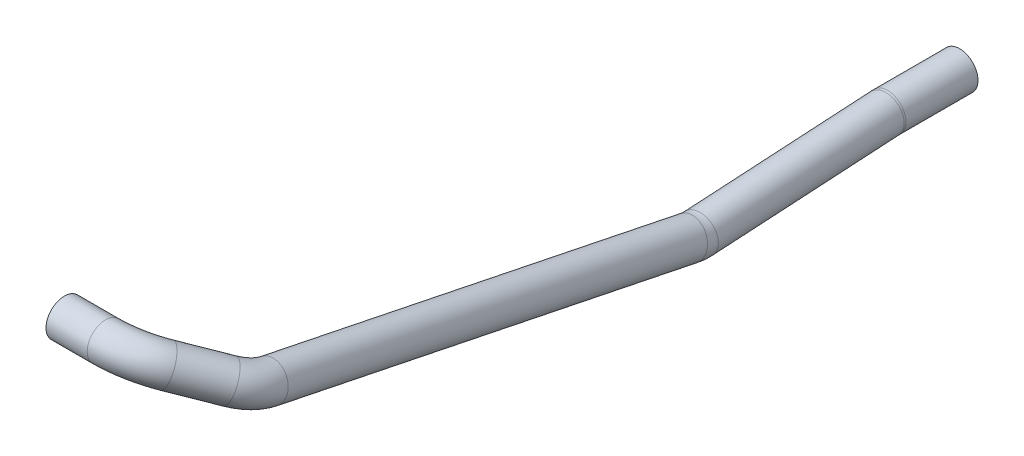
ISO-10303-21;
HEADER;
FILE_DESCRIPTION(('STEP AP214'),'2;1');
FILE_NAME('part.step','',(''),(''),'','','');
FILE_SCHEMA(('AUTOMOTIVE_DESIGN { 1 0 10303 214 1 1 1 1 }'));
ENDSEC;
DATA;
#1=APPLICATION_CONTEXT('core data for automotive mechanical design processes');
#2=APPLICATION_PROTOCOL_DEFINITION('international standard','automotive_design',2000,#1);
#3=PRODUCT_CONTEXT('',#1,'mechanical');
#4=PRODUCT('Part','Part','',(#3));
#5=PRODUCT_RELATED_PRODUCT_CATEGORY('part','',(#4));
#6=PRODUCT_DEFINITION_FORMATION('','',#4);
#7=PRODUCT_DEFINITION_CONTEXT('part definition',#1,'design');
#8=PRODUCT_DEFINITION('design','',#6,#7);
#9=PRODUCT_DEFINITION_SHAPE('','',#8);
#10=(LENGTH_UNIT() NAMED_UNIT(*) SI_UNIT(.MILLI.,.METRE.));
#11=(NAMED_UNIT(*) PLANE_ANGLE_UNIT() SI_UNIT($,.RADIAN.));
#12=(NAMED_UNIT(*) SI_UNIT($,.STERADIAN.) SOLID_ANGLE_UNIT());
#13=UNCERTAINTY_MEASURE_WITH_UNIT(LENGTH_MEASURE(1.E-05),#10,'distance_accuracy_value','');
#14=(GEOMETRIC_REPRESENTATION_CONTEXT(3) GLOBAL_UNCERTAINTY_ASSIGNED_CONTEXT((#13)) GLOBAL_UNIT_ASSIGNED_CONTEXT((#10,
#11,#12)) REPRESENTATION_CONTEXT('',''));
#15=CARTESIAN_POINT('',(0.,0.,0.));
#16=DIRECTION('',(0.,0.,1.));
#17=DIRECTION('',(1.,0.,0.));
#18=AXIS2_PLACEMENT_3D('',#15,#16,#17);
#19=CARTESIAN_POINT('',(84.,-22.,-33.));
#20=DIRECTION('',(0.,0.,-1.));
#21=DIRECTION('',(0.,-1.,0.));
#22=AXIS2_PLACEMENT_3D('',#19,#20,#21);
#23=PLANE('',#22);
#24=CARTESIAN_POINT('',(84.,-22.,-33.));
#25=DIRECTION('',(0.,0.,-1.));
#26=DIRECTION('',(0.926024073337656,-0.37746445607386,0.));
#27=AXIS2_PLACEMENT_3D('',#24,#25,#26);
#28=CIRCLE('',#27,3.25);
#29=CARTESIAN_POINT('',(87.0095782383474,-23.22675948224,-33.));
#30=VERTEX_POINT('',#29);
#31=EDGE_CURVE('E10',#30,#30,#28,.T.);
#32=ORIENTED_EDGE('',*,*,#31,.T.);
#33=EDGE_LOOP('',(#32));
#34=FACE_BOUND('',#33,.T.);
#35=ADVANCED_FACE('F15',(#34),#23,.T.);
#36=CARTESIAN_POINT('',(64.7,0.,106.1));
#37=DIRECTION('',(1.,0.,0.));
#38=DIRECTION('',(0.,1.,0.));
#39=AXIS2_PLACEMENT_3D('',#36,#37,#38);
#40=PLANE('',#39);
#41=CARTESIAN_POINT('',(64.7,0.,106.1));
#42=DIRECTION('',(1.,0.,0.));
#43=DIRECTION('',(0.,0.,1.));
#44=AXIS2_PLACEMENT_3D('',#41,#42,#43);
#45=CIRCLE('',#44,3.25);
#46=CARTESIAN_POINT('',(64.7,0.,109.35));
#47=VERTEX_POINT('',#46);
#48=EDGE_CURVE('E36',#47,#47,#45,.T.);
#49=ORIENTED_EDGE('',*,*,#48,.F.);
#50=EDGE_LOOP('',(#49));
#51=FACE_BOUND('',#50,.T.);
#52=ADVANCED_FACE('F17',(#51),#40,.F.);
#53=CARTESIAN_POINT('',(84.,-22.,-20.24980739588));
#54=DIRECTION('',(0.,0.,-1.));
#55=DIRECTION('',(0.926024073337656,-0.37746445607386,0.));
#56=AXIS2_PLACEMENT_3D('',#53,#54,#55);
#57=CYLINDRICAL_SURFACE('',#56,3.25);
#58=ORIENTED_EDGE('',*,*,#31,.F.);
#59=EDGE_LOOP('',(#58));
#60=FACE_BOUND('',#59,.T.);
#61=CARTESIAN_POINT('',(84.,-22.,-20.24980739588));
#62=DIRECTION('',(0.,0.,1.));
#63=DIRECTION('',(-1.,0.,0.));
#64=AXIS2_PLACEMENT_3D('',#61,#62,#63);
#65=CIRCLE('',#64,3.25);
#66=CARTESIAN_POINT('',(80.75,-22.,-20.24980739588));
#67=VERTEX_POINT('',#66);
#68=EDGE_CURVE('E19',#67,#67,#65,.T.);
#69=ORIENTED_EDGE('',*,*,#68,.F.);
#70=EDGE_LOOP('',(#69));
#71=FACE_BOUND('',#70,.T.);
#72=ADVANCED_FACE('F71',(#60,#71),#57,.T.);
#73=CARTESIAN_POINT('',(93.,-22.,-20.24980739588));
#74=DIRECTION('',(0.,-1.,0.));
#75=DIRECTION('',(-0.998460353205411,0.,0.0554700196225528));
#76=AXIS2_PLACEMENT_3D('',#73,#74,#75);
#77=TOROIDAL_SURFACE('',#76,9.,3.25);
#78=CARTESIAN_POINT('',(84.013856821151,-22.,-19.75057721927));
#79=DIRECTION('',(-0.0554700196225401,0.,-0.998460353205411));
#80=DIRECTION('',(0.92459832334132,-0.37746445607413,-0.0513665735189778));
#81=AXIS2_PLACEMENT_3D('',#78,#79,#80);
#82=CIRCLE('',#81,3.25);
#83=CARTESIAN_POINT('',(80.7688606732342,-22.,-19.5702996554942));
#84=VERTEX_POINT('',#83);
#85=EDGE_CURVE('E33',#84,#84,#82,.T.);
#86=CARTESIAN_POINT('',(93.,-22.,-20.24980739588));
#87=DIRECTION('',(0.,-1.,0.));
#88=DIRECTION('',(-0.998460353205411,0.,0.0554700196225528));
#89=AXIS2_PLACEMENT_3D('',#86,#87,#88);
#90=CIRCLE('',#89,12.25);
#91=EDGE_CURVE('',#84,#67,#90,.T.);
#92=ORIENTED_EDGE('',*,*,#85,.T.);
#93=ORIENTED_EDGE('',*,*,#68,.T.);
#94=ORIENTED_EDGE('',*,*,#91,.T.);
#95=ORIENTED_EDGE('',*,*,#91,.F.);
#96=EDGE_LOOP('',(#92,#94,#93,#95));
#97=FACE_BOUND('',#96,.T.);
#98=ADVANCED_FACE('F60',(#97),#77,.T.);
#99=CARTESIAN_POINT('',(85.947525635538,-22.,15.055461439676));
#100=DIRECTION('',(-0.0554700196225401,0.,-0.998460353205411));
#101=DIRECTION('',(0.92459832334132,-0.37746445607413,-0.0513665735189778));
#102=AXIS2_PLACEMENT_3D('',#99,#100,#101);
#103=CYLINDRICAL_SURFACE('',#102,3.25);
#104=ORIENTED_EDGE('',*,*,#85,.F.);
#105=EDGE_LOOP('',(#104));
#106=FACE_BOUND('',#105,.T.);
#107=CARTESIAN_POINT('',(85.947525635538,-22.,15.055461439676));
#108=DIRECTION('',(0.0554700196225338,0.,0.998460353205412));
#109=DIRECTION('',(0.260949865530859,-0.965243491790476,-0.0144972147516821));
#110=AXIS2_PLACEMENT_3D('',#107,#108,#109);
#111=CIRCLE('',#110,3.25);
#112=CARTESIAN_POINT('',(86.7956126985109,-25.1370413483145,15.0083454917332));
#113=VERTEX_POINT('',#112);
#114=EDGE_CURVE('E45',#113,#113,#111,.T.);
#115=ORIENTED_EDGE('',*,*,#114,.F.);
#116=EDGE_LOOP('',(#115));
#117=FACE_BOUND('',#116,.T.);
#118=ADVANCED_FACE('F58',(#106,#117),#103,.T.);
#119=CARTESIAN_POINT('',(83.598976845762,-13.31280857388,15.185936372441));
#120=DIRECTION('',(0.963757357742389,0.261352255693411,-0.0535420754302142));
#121=DIRECTION('',(0.266780350470961,-0.944148093899862,0.193423425126971));
#122=AXIS2_PLACEMENT_3D('',#119,#120,#121);
#123=TOROIDAL_SURFACE('',#122,9.,3.25);
#124=CARTESIAN_POINT('',(86.,-21.81014141898,16.926747198582));
#125=DIRECTION('',(-1.18732111585001E-13,-0.200697222773899,-0.979653318664743));
#126=DIRECTION('',(0.928133717121023,-0.364672974877009,0.0747089321130019));
#127=AXIS2_PLACEMENT_3D('',#124,#125,#126);
#128=CIRCLE('',#127,3.25);
#129=CARTESIAN_POINT('',(86.8670361390301,-24.8786227241541,17.5553733302439));
#130=VERTEX_POINT('',#129);
#131=EDGE_CURVE('E46',#130,#130,#128,.T.);
#132=CARTESIAN_POINT('',(83.598976845762,-13.31280857388,15.185936372441));
#133=DIRECTION('',(0.963757357742389,0.261352255693411,-0.0535420754302142));
#134=DIRECTION('',(0.266780350470961,-0.944148093899862,0.193423425126971));
#135=AXIS2_PLACEMENT_3D('',#132,#133,#134);
#136=CIRCLE('',#135,12.25);
#137=EDGE_CURVE('',#130,#113,#136,.T.);
#138=ORIENTED_EDGE('',*,*,#131,.T.);
#139=ORIENTED_EDGE('',*,*,#114,.T.);
#140=ORIENTED_EDGE('',*,*,#137,.T.);
#141=ORIENTED_EDGE('',*,*,#137,.F.);
#142=EDGE_LOOP('',(#138,#140,#139,#141));
#143=FACE_BOUND('',#142,.T.);
#144=ADVANCED_FACE('F55',(#143),#123,.T.);
#145=CARTESIAN_POINT('',(86.,-6.612244355225,91.111482241056));
#146=DIRECTION('',(-1.18732111585001E-13,-0.200697222773899,-0.979653318664743));
#147=DIRECTION('',(0.928133717121023,-0.364672974877009,0.0747089321130019));
#148=AXIS2_PLACEMENT_3D('',#145,#146,#147);
#149=CYLINDRICAL_SURFACE('',#148,3.25);
#150=ORIENTED_EDGE('',*,*,#131,.F.);
#151=EDGE_LOOP('',(#150));
#152=FACE_BOUND('',#151,.T.);
#153=CARTESIAN_POINT('',(86.,-6.612244355225,91.111482241056));
#154=DIRECTION('',(0.,0.20069722277391,0.979653318664741));
#155=DIRECTION('',(0.936922258101465,-0.342425877883804,0.0701512681963599));
#156=AXIS2_PLACEMENT_3D('',#153,#154,#155);
#157=CIRCLE('',#156,3.25);
#158=CARTESIAN_POINT('',(89.0449973388296,-7.72512845834674,91.3394738626944));
#159=VERTEX_POINT('',#158);
#160=EDGE_CURVE('E49',#159,#159,#157,.T.);
#161=ORIENTED_EDGE('',*,*,#160,.F.);
#162=EDGE_LOOP('',(#161));
#163=FACE_BOUND('',#162,.T.);
#164=ADVANCED_FACE('F69',(#152,#163),#149,.T.);
#165=CARTESIAN_POINT('',(77.567699677086,-3.530411454272,90.480120827288));
#166=DIRECTION('',(0.349537812366846,0.917858999479875,-0.188037695156057));
#167=DIRECTION('',(0.743821753973419,-0.149817756898084,0.651370737778367));
#168=AXIS2_PLACEMENT_3D('',#165,#166,#167);
#169=TOROIDAL_SURFACE('',#168,9.,3.25);
#170=CARTESIAN_POINT('',(84.262095462848,-4.878771266353,96.342457467293));
#171=DIRECTION('',(0.569695107967355,-0.367545230947144,-0.735090461893007));
#172=DIRECTION('',(0.735090461893094,-0.172121956813022,0.655756086374083));
#173=AXIS2_PLACEMENT_3D('',#170,#171,#172);
#174=CIRCLE('',#173,3.25);
#175=CARTESIAN_POINT('',(86.6795161632616,-5.36567897627104,98.4594123650722));
#176=VERTEX_POINT('',#175);
#177=EDGE_CURVE('E41',#176,#176,#174,.T.);
#178=CARTESIAN_POINT('',(77.567699677086,-3.530411454272,90.480120827288));
#179=DIRECTION('',(0.349537812366846,0.917858999479875,-0.188037695156057));
#180=DIRECTION('',(0.743821753973419,-0.149817756898084,0.651370737778367));
#181=AXIS2_PLACEMENT_3D('',#178,#179,#180);
#182=CIRCLE('',#181,12.25);
#183=EDGE_CURVE('',#176,#159,#182,.T.);
#184=ORIENTED_EDGE('',*,*,#177,.T.);
#185=ORIENTED_EDGE('',*,*,#160,.T.);
#186=ORIENTED_EDGE('',*,*,#183,.T.);
#187=ORIENTED_EDGE('',*,*,#183,.F.);
#188=EDGE_LOOP('',(#184,#186,#185,#187));
#189=FACE_BOUND('',#188,.T.);
#190=ADVANCED_FACE('F88',(#189),#169,.T.);
#191=CARTESIAN_POINT('',(79.384512861084,-1.731943781344,102.63611243731));
#192=DIRECTION('',(0.569695107967355,-0.367545230947144,-0.735090461893007));
#193=DIRECTION('',(0.735090461893094,-0.172121956813022,0.655756086374083));
#194=AXIS2_PLACEMENT_3D('',#191,#192,#193);
#195=CYLINDRICAL_SURFACE('',#194,3.25);
#196=ORIENTED_EDGE('',*,*,#177,.F.);
#197=EDGE_LOOP('',(#196));
#198=FACE_BOUND('',#197,.T.);
#199=CARTESIAN_POINT('',(79.384512861084,-1.731943781344,102.63611243731));
#200=DIRECTION('',(-0.569695107967409,0.367545230947015,0.735090461893029));
#201=DIRECTION('',(0.82185612120249,0.254775397572842,0.509550795145684));
#202=AXIS2_PLACEMENT_3D('',#199,#200,#201);
#203=CIRCLE('',#202,3.25);
#204=CARTESIAN_POINT('',(82.0555452549929,-0.903923739231936,104.292152521533));
#205=VERTEX_POINT('',#204);
#206=EDGE_CURVE('E38',#205,#205,#203,.T.);
#207=ORIENTED_EDGE('',*,*,#206,.F.);
#208=EDGE_LOOP('',(#207));
#209=FACE_BOUND('',#208,.T.);
#210=ADVANCED_FACE('F85',(#198,#209),#195,.T.);
#211=CARTESIAN_POINT('',(71.987807770261,-4.0249223595,98.050155281001));
#212=DIRECTION('',(0.,0.894427190999916,-0.447213595499958));
#213=DIRECTION('',(0.,0.447213595499958,0.894427190999916));
#214=AXIS2_PLACEMENT_3D('',#211,#212,#213);
#215=TOROIDAL_SURFACE('',#214,9.,3.25);
#216=CARTESIAN_POINT('',(71.987807770261,0.,106.1));
#217=DIRECTION('',(1.,0.,0.));
#218=DIRECTION('',(0.,0.,1.));
#219=AXIS2_PLACEMENT_3D('',#216,#217,#218);
#220=CIRCLE('',#219,3.25);
#221=CARTESIAN_POINT('',(71.987807770261,1.45344418537503,109.00688837075));
#222=VERTEX_POINT('',#221);
#223=EDGE_CURVE('E109',#222,#222,#220,.T.);
#224=CARTESIAN_POINT('',(71.987807770261,-4.0249223595,98.050155281001));
#225=DIRECTION('',(0.,0.894427190999916,-0.447213595499958));
#226=DIRECTION('',(0.,0.447213595499958,0.894427190999916));
#227=AXIS2_PLACEMENT_3D('',#224,#225,#226);
#228=CIRCLE('',#227,12.25);
#229=EDGE_CURVE('',#222,#205,#228,.T.);
#230=ORIENTED_EDGE('',*,*,#223,.T.);
#231=ORIENTED_EDGE('',*,*,#206,.T.);
#232=ORIENTED_EDGE('',*,*,#229,.T.);
#233=ORIENTED_EDGE('',*,*,#229,.F.);
#234=EDGE_LOOP('',(#230,#232,#231,#233));
#235=FACE_BOUND('',#234,.T.);
#236=ADVANCED_FACE('F84',(#235),#215,.T.);
#237=CARTESIAN_POINT('',(64.7,0.,106.1));
#238=DIRECTION('',(1.,0.,0.));
#239=DIRECTION('',(0.,0.,1.));
#240=AXIS2_PLACEMENT_3D('',#237,#238,#239);
#241=CYLINDRICAL_SURFACE('',#240,3.25);
#242=ORIENTED_EDGE('',*,*,#223,.F.);
#243=EDGE_LOOP('',(#242));
#244=FACE_BOUND('',#243,.T.);
#245=ORIENTED_EDGE('',*,*,#48,.T.);
#246=EDGE_LOOP('',(#245));
#247=FACE_BOUND('',#246,.T.);
#248=ADVANCED_FACE('F118',(#244,#247),#241,.T.);
#249=CLOSED_SHELL('',(#35,#52,#72,#98,#118,#144,#164,#190,#210,#236,#248));
#250=MANIFOLD_SOLID_BREP('B1',#249);
#251=ADVANCED_BREP_SHAPE_REPRESENTATION('',(#18,#250),#14);
#252=SHAPE_DEFINITION_REPRESENTATION(#9,#251);
ENDSEC;
END-ISO-10303-21;
